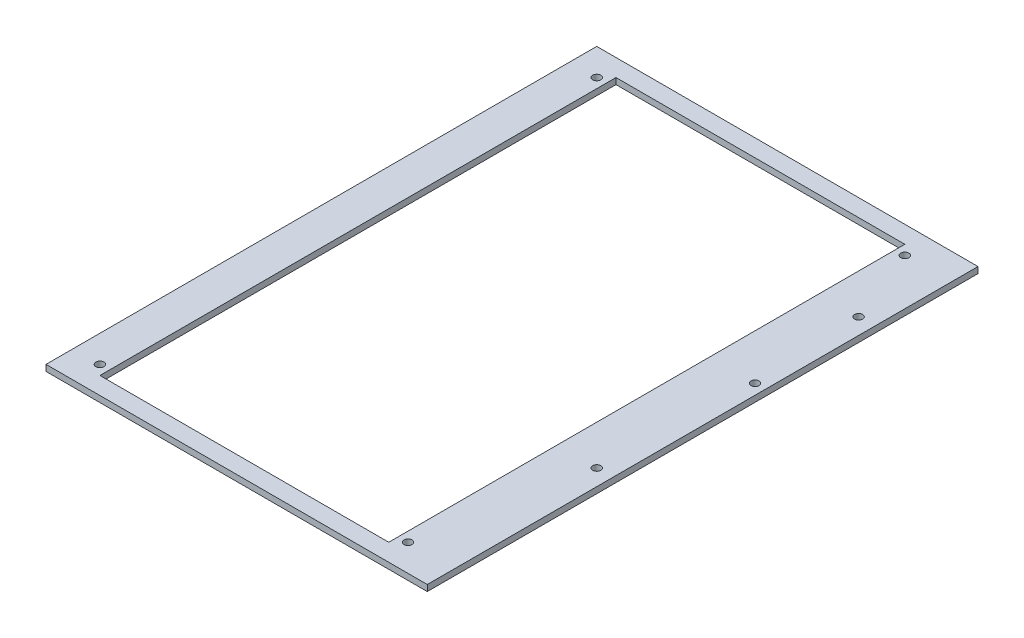
ISO-10303-21;
HEADER;
FILE_DESCRIPTION(('STEP AP214'),'2;1');
FILE_NAME('part.step','',(''),(''),'','','');
FILE_SCHEMA(('AUTOMOTIVE_DESIGN { 1 0 10303 214 1 1 1 1 }'));
ENDSEC;
DATA;
#1=APPLICATION_CONTEXT('core data for automotive mechanical design processes');
#2=APPLICATION_PROTOCOL_DEFINITION('international standard','automotive_design',2000,#1);
#3=PRODUCT_CONTEXT('',#1,'mechanical');
#4=PRODUCT('Part','Part','',(#3));
#5=PRODUCT_RELATED_PRODUCT_CATEGORY('part','',(#4));
#6=PRODUCT_DEFINITION_FORMATION('','',#4);
#7=PRODUCT_DEFINITION_CONTEXT('part definition',#1,'design');
#8=PRODUCT_DEFINITION('design','',#6,#7);
#9=PRODUCT_DEFINITION_SHAPE('','',#8);
#10=(LENGTH_UNIT() NAMED_UNIT(*) SI_UNIT(.MILLI.,.METRE.));
#11=(NAMED_UNIT(*) PLANE_ANGLE_UNIT() SI_UNIT($,.RADIAN.));
#12=(NAMED_UNIT(*) SI_UNIT($,.STERADIAN.) SOLID_ANGLE_UNIT());
#13=UNCERTAINTY_MEASURE_WITH_UNIT(LENGTH_MEASURE(1.E-05),#10,'distance_accuracy_value','');
#14=(GEOMETRIC_REPRESENTATION_CONTEXT(3) GLOBAL_UNCERTAINTY_ASSIGNED_CONTEXT((#13)) GLOBAL_UNIT_ASSIGNED_CONTEXT((#10,
#11,#12)) REPRESENTATION_CONTEXT('',''));
#15=CARTESIAN_POINT('',(0.,0.,0.));
#16=DIRECTION('',(0.,0.,1.));
#17=DIRECTION('',(1.,0.,0.));
#18=AXIS2_PLACEMENT_3D('',#15,#16,#17);
#19=CARTESIAN_POINT('',(0.,1.6,4.5));
#20=DIRECTION('',(0.,0.,-1.));
#21=DIRECTION('',(-1.,0.,0.));
#22=AXIS2_PLACEMENT_3D('',#19,#20,#21);
#23=PLANE('',#22);
#24=DIRECTION('',(1.,0.,0.));
#25=VECTOR('',#24,1.);
#26=CARTESIAN_POINT('',(0.,0.,4.5));
#27=LINE('',#26,#25);
#28=CARTESIAN_POINT('',(9.5,0.,4.5));
#29=VERTEX_POINT('',#28);
#30=CARTESIAN_POINT('',(84.5,0.,4.5));
#31=VERTEX_POINT('',#30);
#32=EDGE_CURVE('E187',#29,#31,#27,.T.);
#33=ORIENTED_EDGE('',*,*,#32,.T.);
#34=DIRECTION('',(0.,-1.,0.));
#35=VECTOR('',#34,1.);
#36=CARTESIAN_POINT('',(84.5,1.6,4.5));
#37=LINE('',#36,#35);
#38=CARTESIAN_POINT('',(84.5,1.6,4.5));
#39=VERTEX_POINT('',#38);
#40=EDGE_CURVE('E11',#39,#31,#37,.T.);
#41=ORIENTED_EDGE('',*,*,#40,.F.);
#42=DIRECTION('',(1.,0.,0.));
#43=VECTOR('',#42,1.);
#44=CARTESIAN_POINT('',(0.,1.6,4.5));
#45=LINE('',#44,#43);
#46=CARTESIAN_POINT('',(9.5,1.6,4.5));
#47=VERTEX_POINT('',#46);
#48=EDGE_CURVE('E123',#47,#39,#45,.T.);
#49=ORIENTED_EDGE('',*,*,#48,.F.);
#50=DIRECTION('',(0.,-1.,0.));
#51=VECTOR('',#50,1.);
#52=CARTESIAN_POINT('',(9.5,1.6,4.5));
#53=LINE('',#52,#51);
#54=EDGE_CURVE('E61',#47,#29,#53,.T.);
#55=ORIENTED_EDGE('',*,*,#54,.T.);
#56=EDGE_LOOP('',(#33,#41,#49,#55));
#57=FACE_BOUND('',#56,.T.);
#58=ADVANCED_FACE('F41',(#57),#23,.F.);
#59=CARTESIAN_POINT('',(84.5,1.6,0.));
#60=DIRECTION('',(1.,0.,0.));
#61=DIRECTION('',(0.,0.,-1.));
#62=AXIS2_PLACEMENT_3D('',#59,#60,#61);
#63=PLANE('',#62);
#64=DIRECTION('',(0.,0.,1.));
#65=VECTOR('',#64,1.);
#66=CARTESIAN_POINT('',(84.5,0.,0.));
#67=LINE('',#66,#65);
#68=CARTESIAN_POINT('',(84.5,0.,138.5));
#69=VERTEX_POINT('',#68);
#70=EDGE_CURVE('E130',#31,#69,#67,.T.);
#71=ORIENTED_EDGE('',*,*,#70,.T.);
#72=DIRECTION('',(0.,-1.,0.));
#73=VECTOR('',#72,1.);
#74=CARTESIAN_POINT('',(84.5,1.6,138.5));
#75=LINE('',#74,#73);
#76=CARTESIAN_POINT('',(84.5,1.6,138.5));
#77=VERTEX_POINT('',#76);
#78=EDGE_CURVE('E52',#77,#69,#75,.T.);
#79=ORIENTED_EDGE('',*,*,#78,.F.);
#80=DIRECTION('',(0.,0.,1.));
#81=VECTOR('',#80,1.);
#82=CARTESIAN_POINT('',(84.5,1.6,0.));
#83=LINE('',#82,#81);
#84=EDGE_CURVE('E116',#39,#77,#83,.T.);
#85=ORIENTED_EDGE('',*,*,#84,.F.);
#86=ORIENTED_EDGE('',*,*,#40,.T.);
#87=EDGE_LOOP('',(#71,#79,#85,#86));
#88=FACE_BOUND('',#87,.T.);
#89=ADVANCED_FACE('F129',(#88),#63,.F.);
#90=CARTESIAN_POINT('',(0.,1.6,138.5));
#91=DIRECTION('',(0.,0.,-1.));
#92=DIRECTION('',(-1.,0.,0.));
#93=AXIS2_PLACEMENT_3D('',#90,#91,#92);
#94=PLANE('',#93);
#95=DIRECTION('',(1.,0.,0.));
#96=VECTOR('',#95,1.);
#97=CARTESIAN_POINT('',(0.,0.,138.5));
#98=LINE('',#97,#96);
#99=CARTESIAN_POINT('',(9.50000000000002,0.,138.5));
#100=VERTEX_POINT('',#99);
#101=EDGE_CURVE('E192',#100,#69,#98,.T.);
#102=ORIENTED_EDGE('',*,*,#101,.F.);
#103=DIRECTION('',(0.,-1.,0.));
#104=VECTOR('',#103,1.);
#105=CARTESIAN_POINT('',(9.50000000000002,1.6,138.5));
#106=LINE('',#105,#104);
#107=CARTESIAN_POINT('',(9.50000000000002,1.6,138.5));
#108=VERTEX_POINT('',#107);
#109=EDGE_CURVE('E87',#108,#100,#106,.T.);
#110=ORIENTED_EDGE('',*,*,#109,.F.);
#111=DIRECTION('',(1.,0.,0.));
#112=VECTOR('',#111,1.);
#113=CARTESIAN_POINT('',(0.,1.6,138.5));
#114=LINE('',#113,#112);
#115=EDGE_CURVE('E122',#108,#77,#114,.T.);
#116=ORIENTED_EDGE('',*,*,#115,.T.);
#117=ORIENTED_EDGE('',*,*,#78,.T.);
#118=EDGE_LOOP('',(#102,#110,#116,#117));
#119=FACE_BOUND('',#118,.T.);
#120=ADVANCED_FACE('F135',(#119),#94,.T.);
#121=CARTESIAN_POINT('',(0.,1.6,143.));
#122=DIRECTION('',(0.,0.,-1.));
#123=DIRECTION('',(-1.,0.,0.));
#124=AXIS2_PLACEMENT_3D('',#121,#122,#123);
#125=PLANE('',#124);
#126=DIRECTION('',(1.,0.,0.));
#127=VECTOR('',#126,1.);
#128=CARTESIAN_POINT('',(0.,0.,143.));
#129=LINE('',#128,#127);
#130=CARTESIAN_POINT('',(0.,0.,143.));
#131=VERTEX_POINT('',#130);
#132=CARTESIAN_POINT('',(99.,0.,143.));
#133=VERTEX_POINT('',#132);
#134=EDGE_CURVE('E152',#131,#133,#129,.T.);
#135=ORIENTED_EDGE('',*,*,#134,.T.);
#136=DIRECTION('',(0.,-1.,0.));
#137=VECTOR('',#136,1.);
#138=CARTESIAN_POINT('',(99.,1.6,143.));
#139=LINE('',#138,#137);
#140=CARTESIAN_POINT('',(99.,1.6,143.));
#141=VERTEX_POINT('',#140);
#142=EDGE_CURVE('E45',#141,#133,#139,.T.);
#143=ORIENTED_EDGE('',*,*,#142,.F.);
#144=DIRECTION('',(1.,0.,0.));
#145=VECTOR('',#144,1.);
#146=CARTESIAN_POINT('',(0.,1.6,143.));
#147=LINE('',#146,#145);
#148=CARTESIAN_POINT('',(0.,1.6,143.));
#149=VERTEX_POINT('',#148);
#150=EDGE_CURVE('E100',#149,#141,#147,.T.);
#151=ORIENTED_EDGE('',*,*,#150,.F.);
#152=DIRECTION('',(0.,-1.,0.));
#153=VECTOR('',#152,1.);
#154=CARTESIAN_POINT('',(0.,1.6,143.));
#155=LINE('',#154,#153);
#156=EDGE_CURVE('E151',#149,#131,#155,.T.);
#157=ORIENTED_EDGE('',*,*,#156,.T.);
#158=EDGE_LOOP('',(#135,#143,#151,#157));
#159=FACE_BOUND('',#158,.T.);
#160=ADVANCED_FACE('F43',(#159),#125,.F.);
#161=CARTESIAN_POINT('',(99.,1.6,0.));
#162=DIRECTION('',(1.,0.,0.));
#163=DIRECTION('',(0.,0.,-1.));
#164=AXIS2_PLACEMENT_3D('',#161,#162,#163);
#165=PLANE('',#164);
#166=DIRECTION('',(0.,0.,1.));
#167=VECTOR('',#166,1.);
#168=CARTESIAN_POINT('',(99.,0.,0.));
#169=LINE('',#168,#167);
#170=CARTESIAN_POINT('',(99.,0.,0.));
#171=VERTEX_POINT('',#170);
#172=EDGE_CURVE('E156',#171,#133,#169,.T.);
#173=ORIENTED_EDGE('',*,*,#172,.F.);
#174=DIRECTION('',(0.,-1.,0.));
#175=VECTOR('',#174,1.);
#176=CARTESIAN_POINT('',(99.,1.6,0.));
#177=LINE('',#176,#175);
#178=CARTESIAN_POINT('',(99.,1.6,0.));
#179=VERTEX_POINT('',#178);
#180=EDGE_CURVE('E216',#179,#171,#177,.T.);
#181=ORIENTED_EDGE('',*,*,#180,.F.);
#182=DIRECTION('',(0.,0.,1.));
#183=VECTOR('',#182,1.);
#184=CARTESIAN_POINT('',(99.,1.6,0.));
#185=LINE('',#184,#183);
#186=EDGE_CURVE('E226',#179,#141,#185,.T.);
#187=ORIENTED_EDGE('',*,*,#186,.T.);
#188=ORIENTED_EDGE('',*,*,#142,.T.);
#189=EDGE_LOOP('',(#173,#181,#187,#188));
#190=FACE_BOUND('',#189,.T.);
#191=ADVANCED_FACE('F225',(#190),#165,.T.);
#192=CARTESIAN_POINT('',(0.,1.6,0.));
#193=DIRECTION('',(0.,0.,-1.));
#194=DIRECTION('',(-1.,0.,0.));
#195=AXIS2_PLACEMENT_3D('',#192,#193,#194);
#196=PLANE('',#195);
#197=DIRECTION('',(1.,0.,0.));
#198=VECTOR('',#197,1.);
#199=CARTESIAN_POINT('',(0.,0.,0.));
#200=LINE('',#199,#198);
#201=CARTESIAN_POINT('',(0.,0.,0.));
#202=VERTEX_POINT('',#201);
#203=EDGE_CURVE('E160',#202,#171,#200,.T.);
#204=ORIENTED_EDGE('',*,*,#203,.F.);
#205=DIRECTION('',(0.,-1.,0.));
#206=VECTOR('',#205,1.);
#207=CARTESIAN_POINT('',(0.,1.6,0.));
#208=LINE('',#207,#206);
#209=CARTESIAN_POINT('',(0.,1.6,0.));
#210=VERTEX_POINT('',#209);
#211=EDGE_CURVE('E214',#210,#202,#208,.T.);
#212=ORIENTED_EDGE('',*,*,#211,.F.);
#213=DIRECTION('',(1.,0.,0.));
#214=VECTOR('',#213,1.);
#215=CARTESIAN_POINT('',(0.,1.6,0.));
#216=LINE('',#215,#214);
#217=EDGE_CURVE('E237',#210,#179,#216,.T.);
#218=ORIENTED_EDGE('',*,*,#217,.T.);
#219=ORIENTED_EDGE('',*,*,#180,.T.);
#220=EDGE_LOOP('',(#204,#212,#218,#219));
#221=FACE_BOUND('',#220,.T.);
#222=ADVANCED_FACE('F234',(#221),#196,.T.);
#223=CARTESIAN_POINT('',(87.,1.6,136.));
#224=DIRECTION('',(0.,-1.,0.));
#225=DIRECTION('',(0.,0.,-1.));
#226=AXIS2_PLACEMENT_3D('',#223,#224,#225);
#227=CYLINDRICAL_SURFACE('',#226,1.04999999999999);
#228=CARTESIAN_POINT('',(87.,1.6,136.));
#229=DIRECTION('',(0.,1.,0.));
#230=DIRECTION('',(0.,0.,1.));
#231=AXIS2_PLACEMENT_3D('',#228,#229,#230);
#232=CIRCLE('',#231,1.04999999999999);
#233=CARTESIAN_POINT('',(87.,1.6,137.05));
#234=VERTEX_POINT('',#233);
#235=EDGE_CURVE('E140',#234,#234,#232,.T.);
#236=ORIENTED_EDGE('',*,*,#235,.T.);
#237=EDGE_LOOP('',(#236));
#238=FACE_BOUND('',#237,.T.);
#239=CARTESIAN_POINT('',(87.,0.,136.));
#240=DIRECTION('',(0.,1.,0.));
#241=DIRECTION('',(0.,0.,1.));
#242=AXIS2_PLACEMENT_3D('',#239,#240,#241);
#243=CIRCLE('',#242,1.04999999999999);
#244=CARTESIAN_POINT('',(87.,0.,137.05));
#245=VERTEX_POINT('',#244);
#246=EDGE_CURVE('E199',#245,#245,#243,.T.);
#247=ORIENTED_EDGE('',*,*,#246,.F.);
#248=EDGE_LOOP('',(#247));
#249=FACE_BOUND('',#248,.T.);
#250=ADVANCED_FACE('F315',(#238,#249),#227,.F.);
#251=CARTESIAN_POINT('',(9.5,1.6,0.));
#252=DIRECTION('',(1.,0.,0.));
#253=DIRECTION('',(0.,0.,-1.));
#254=AXIS2_PLACEMENT_3D('',#251,#252,#253);
#255=PLANE('',#254);
#256=DIRECTION('',(0.,0.,1.));
#257=VECTOR('',#256,1.);
#258=CARTESIAN_POINT('',(9.5,0.,0.));
#259=LINE('',#258,#257);
#260=EDGE_CURVE('E195',#29,#100,#259,.T.);
#261=ORIENTED_EDGE('',*,*,#260,.F.);
#262=ORIENTED_EDGE('',*,*,#54,.F.);
#263=DIRECTION('',(0.,0.,1.));
#264=VECTOR('',#263,1.);
#265=CARTESIAN_POINT('',(9.5,1.6,0.));
#266=LINE('',#265,#264);
#267=EDGE_CURVE('E137',#47,#108,#266,.T.);
#268=ORIENTED_EDGE('',*,*,#267,.T.);
#269=ORIENTED_EDGE('',*,*,#109,.T.);
#270=EDGE_LOOP('',(#261,#262,#268,#269));
#271=FACE_BOUND('',#270,.T.);
#272=ADVANCED_FACE('F296',(#271),#255,.T.);
#273=CARTESIAN_POINT('',(94.8,1.6,26.8));
#274=DIRECTION('',(0.,-1.,0.));
#275=DIRECTION('',(0.,0.,-1.));
#276=AXIS2_PLACEMENT_3D('',#273,#274,#275);
#277=CYLINDRICAL_SURFACE('',#276,1.05);
#278=CARTESIAN_POINT('',(94.8,1.6,26.8));
#279=DIRECTION('',(0.,1.,0.));
#280=DIRECTION('',(0.,0.,1.));
#281=AXIS2_PLACEMENT_3D('',#278,#279,#280);
#282=CIRCLE('',#281,1.05);
#283=CARTESIAN_POINT('',(94.8,1.6,27.85));
#284=VERTEX_POINT('',#283);
#285=EDGE_CURVE('E266',#284,#284,#282,.T.);
#286=ORIENTED_EDGE('',*,*,#285,.T.);
#287=EDGE_LOOP('',(#286));
#288=FACE_BOUND('',#287,.T.);
#289=CARTESIAN_POINT('',(94.8,0.,26.8));
#290=DIRECTION('',(0.,1.,0.));
#291=DIRECTION('',(0.,0.,1.));
#292=AXIS2_PLACEMENT_3D('',#289,#290,#291);
#293=CIRCLE('',#292,1.05);
#294=CARTESIAN_POINT('',(94.8,0.,27.85));
#295=VERTEX_POINT('',#294);
#296=EDGE_CURVE('E183',#295,#295,#293,.T.);
#297=ORIENTED_EDGE('',*,*,#296,.F.);
#298=EDGE_LOOP('',(#297));
#299=FACE_BOUND('',#298,.T.);
#300=ADVANCED_FACE('F272',(#288,#299),#277,.F.);
#301=CARTESIAN_POINT('',(94.8,1.6,94.8));
#302=DIRECTION('',(0.,-1.,0.));
#303=DIRECTION('',(0.,0.,-1.));
#304=AXIS2_PLACEMENT_3D('',#301,#302,#303);
#305=CYLINDRICAL_SURFACE('',#304,1.04999999999999);
#306=CARTESIAN_POINT('',(94.8,1.6,94.8));
#307=DIRECTION('',(0.,1.,0.));
#308=DIRECTION('',(0.,0.,1.));
#309=AXIS2_PLACEMENT_3D('',#306,#307,#308);
#310=CIRCLE('',#309,1.04999999999999);
#311=CARTESIAN_POINT('',(94.8,1.6,95.85));
#312=VERTEX_POINT('',#311);
#313=EDGE_CURVE('E262',#312,#312,#310,.T.);
#314=ORIENTED_EDGE('',*,*,#313,.T.);
#315=EDGE_LOOP('',(#314));
#316=FACE_BOUND('',#315,.T.);
#317=CARTESIAN_POINT('',(94.8,0.,94.8));
#318=DIRECTION('',(0.,1.,0.));
#319=DIRECTION('',(0.,0.,1.));
#320=AXIS2_PLACEMENT_3D('',#317,#318,#319);
#321=CIRCLE('',#320,1.04999999999999);
#322=CARTESIAN_POINT('',(94.8,0.,95.85));
#323=VERTEX_POINT('',#322);
#324=EDGE_CURVE('E179',#323,#323,#321,.T.);
#325=ORIENTED_EDGE('',*,*,#324,.F.);
#326=EDGE_LOOP('',(#325));
#327=FACE_BOUND('',#326,.T.);
#328=ADVANCED_FACE('F295',(#316,#327),#305,.F.);
#329=CARTESIAN_POINT('',(96.3,1.6,55.2));
#330=DIRECTION('',(0.,-1.,0.));
#331=DIRECTION('',(0.,0.,-1.));
#332=AXIS2_PLACEMENT_3D('',#329,#330,#331);
#333=CYLINDRICAL_SURFACE('',#332,1.04999999999999);
#334=CARTESIAN_POINT('',(96.3,1.6,55.2));
#335=DIRECTION('',(0.,1.,0.));
#336=DIRECTION('',(0.,0.,1.));
#337=AXIS2_PLACEMENT_3D('',#334,#335,#336);
#338=CIRCLE('',#337,1.04999999999999);
#339=CARTESIAN_POINT('',(96.3,1.6,56.25));
#340=VERTEX_POINT('',#339);
#341=EDGE_CURVE('E258',#340,#340,#338,.T.);
#342=ORIENTED_EDGE('',*,*,#341,.T.);
#343=EDGE_LOOP('',(#342));
#344=FACE_BOUND('',#343,.T.);
#345=CARTESIAN_POINT('',(96.3,0.,55.2));
#346=DIRECTION('',(0.,1.,0.));
#347=DIRECTION('',(0.,0.,1.));
#348=AXIS2_PLACEMENT_3D('',#345,#346,#347);
#349=CIRCLE('',#348,1.04999999999999);
#350=CARTESIAN_POINT('',(96.3,0.,56.25));
#351=VERTEX_POINT('',#350);
#352=EDGE_CURVE('E175',#351,#351,#349,.T.);
#353=ORIENTED_EDGE('',*,*,#352,.F.);
#354=EDGE_LOOP('',(#353));
#355=FACE_BOUND('',#354,.T.);
#356=ADVANCED_FACE('F299',(#344,#355),#333,.F.);
#357=CARTESIAN_POINT('',(7.,1.6,7.));
#358=DIRECTION('',(0.,-1.,0.));
#359=DIRECTION('',(0.,0.,-1.));
#360=AXIS2_PLACEMENT_3D('',#357,#358,#359);
#361=CYLINDRICAL_SURFACE('',#360,1.04999999999999);
#362=CARTESIAN_POINT('',(7.,1.6,7.));
#363=DIRECTION('',(0.,1.,0.));
#364=DIRECTION('',(0.,0.,1.));
#365=AXIS2_PLACEMENT_3D('',#362,#363,#364);
#366=CIRCLE('',#365,1.04999999999999);
#367=CARTESIAN_POINT('',(7.,1.6,8.05));
#368=VERTEX_POINT('',#367);
#369=EDGE_CURVE('E254',#368,#368,#366,.T.);
#370=ORIENTED_EDGE('',*,*,#369,.T.);
#371=EDGE_LOOP('',(#370));
#372=FACE_BOUND('',#371,.T.);
#373=CARTESIAN_POINT('',(7.,0.,7.));
#374=DIRECTION('',(0.,1.,0.));
#375=DIRECTION('',(0.,0.,1.));
#376=AXIS2_PLACEMENT_3D('',#373,#374,#375);
#377=CIRCLE('',#376,1.04999999999999);
#378=CARTESIAN_POINT('',(7.,0.,8.05));
#379=VERTEX_POINT('',#378);
#380=EDGE_CURVE('E171',#379,#379,#377,.T.);
#381=ORIENTED_EDGE('',*,*,#380,.F.);
#382=EDGE_LOOP('',(#381));
#383=FACE_BOUND('',#382,.T.);
#384=ADVANCED_FACE('F303',(#372,#383),#361,.F.);
#385=CARTESIAN_POINT('',(87.,1.6,7.));
#386=DIRECTION('',(0.,-1.,0.));
#387=DIRECTION('',(0.,0.,-1.));
#388=AXIS2_PLACEMENT_3D('',#385,#386,#387);
#389=CYLINDRICAL_SURFACE('',#388,1.04999999999999);
#390=CARTESIAN_POINT('',(87.,1.6,7.));
#391=DIRECTION('',(0.,1.,0.));
#392=DIRECTION('',(0.,0.,1.));
#393=AXIS2_PLACEMENT_3D('',#390,#391,#392);
#394=CIRCLE('',#393,1.04999999999999);
#395=CARTESIAN_POINT('',(87.,1.6,8.05));
#396=VERTEX_POINT('',#395);
#397=EDGE_CURVE('E242',#396,#396,#394,.T.);
#398=ORIENTED_EDGE('',*,*,#397,.T.);
#399=EDGE_LOOP('',(#398));
#400=FACE_BOUND('',#399,.T.);
#401=CARTESIAN_POINT('',(87.,0.,7.));
#402=DIRECTION('',(0.,1.,0.));
#403=DIRECTION('',(0.,0.,1.));
#404=AXIS2_PLACEMENT_3D('',#401,#402,#403);
#405=CIRCLE('',#404,1.04999999999999);
#406=CARTESIAN_POINT('',(87.,0.,8.05));
#407=VERTEX_POINT('',#406);
#408=EDGE_CURVE('E167',#407,#407,#405,.T.);
#409=ORIENTED_EDGE('',*,*,#408,.F.);
#410=EDGE_LOOP('',(#409));
#411=FACE_BOUND('',#410,.T.);
#412=ADVANCED_FACE('F307',(#400,#411),#389,.F.);
#413=CARTESIAN_POINT('',(0.,1.6,0.));
#414=DIRECTION('',(1.,0.,0.));
#415=DIRECTION('',(0.,0.,-1.));
#416=AXIS2_PLACEMENT_3D('',#413,#414,#415);
#417=PLANE('',#416);
#418=DIRECTION('',(0.,0.,1.));
#419=VECTOR('',#418,1.);
#420=CARTESIAN_POINT('',(0.,0.,0.));
#421=LINE('',#420,#419);
#422=EDGE_CURVE('E164',#202,#131,#421,.T.);
#423=ORIENTED_EDGE('',*,*,#422,.T.);
#424=ORIENTED_EDGE('',*,*,#156,.F.);
#425=DIRECTION('',(0.,0.,1.));
#426=VECTOR('',#425,1.);
#427=CARTESIAN_POINT('',(0.,1.6,0.));
#428=LINE('',#427,#426);
#429=EDGE_CURVE('E239',#210,#149,#428,.T.);
#430=ORIENTED_EDGE('',*,*,#429,.F.);
#431=ORIENTED_EDGE('',*,*,#211,.T.);
#432=EDGE_LOOP('',(#423,#424,#430,#431));
#433=FACE_BOUND('',#432,.T.);
#434=ADVANCED_FACE('F240',(#433),#417,.F.);
#435=CARTESIAN_POINT('',(7.00000000000002,1.6,136.));
#436=DIRECTION('',(0.,-1.,0.));
#437=DIRECTION('',(0.,0.,-1.));
#438=AXIS2_PLACEMENT_3D('',#435,#436,#437);
#439=CYLINDRICAL_SURFACE('',#438,1.04999999999999);
#440=CARTESIAN_POINT('',(7.00000000000002,1.6,136.));
#441=DIRECTION('',(0.,1.,0.));
#442=DIRECTION('',(0.,0.,1.));
#443=AXIS2_PLACEMENT_3D('',#440,#441,#442);
#444=CIRCLE('',#443,1.04999999999999);
#445=CARTESIAN_POINT('',(7.00000000000002,1.6,137.05));
#446=VERTEX_POINT('',#445);
#447=EDGE_CURVE('E147',#446,#446,#444,.T.);
#448=ORIENTED_EDGE('',*,*,#447,.T.);
#449=EDGE_LOOP('',(#448));
#450=FACE_BOUND('',#449,.T.);
#451=CARTESIAN_POINT('',(7.00000000000002,0.,136.));
#452=DIRECTION('',(0.,1.,0.));
#453=DIRECTION('',(0.,0.,1.));
#454=AXIS2_PLACEMENT_3D('',#451,#452,#453);
#455=CIRCLE('',#454,1.04999999999999);
#456=CARTESIAN_POINT('',(7.00000000000002,0.,137.05));
#457=VERTEX_POINT('',#456);
#458=EDGE_CURVE('E203',#457,#457,#455,.T.);
#459=ORIENTED_EDGE('',*,*,#458,.F.);
#460=EDGE_LOOP('',(#459));
#461=FACE_BOUND('',#460,.T.);
#462=ADVANCED_FACE('F276',(#450,#461),#439,.F.);
#463=CARTESIAN_POINT('',(0.,1.6,0.));
#464=DIRECTION('',(0.,1.,0.));
#465=DIRECTION('',(0.,0.,1.));
#466=AXIS2_PLACEMENT_3D('',#463,#464,#465);
#467=PLANE('',#466);
#468=ORIENTED_EDGE('',*,*,#150,.T.);
#469=ORIENTED_EDGE('',*,*,#186,.F.);
#470=ORIENTED_EDGE('',*,*,#217,.F.);
#471=ORIENTED_EDGE('',*,*,#429,.T.);
#472=EDGE_LOOP('',(#468,#469,#470,#471));
#473=FACE_BOUND('',#472,.T.);
#474=ORIENTED_EDGE('',*,*,#397,.F.);
#475=EDGE_LOOP('',(#474));
#476=FACE_BOUND('',#475,.T.);
#477=ORIENTED_EDGE('',*,*,#369,.F.);
#478=EDGE_LOOP('',(#477));
#479=FACE_BOUND('',#478,.T.);
#480=ORIENTED_EDGE('',*,*,#341,.F.);
#481=EDGE_LOOP('',(#480));
#482=FACE_BOUND('',#481,.T.);
#483=ORIENTED_EDGE('',*,*,#313,.F.);
#484=EDGE_LOOP('',(#483));
#485=FACE_BOUND('',#484,.T.);
#486=ORIENTED_EDGE('',*,*,#285,.F.);
#487=EDGE_LOOP('',(#486));
#488=FACE_BOUND('',#487,.T.);
#489=ORIENTED_EDGE('',*,*,#48,.T.);
#490=ORIENTED_EDGE('',*,*,#84,.T.);
#491=ORIENTED_EDGE('',*,*,#115,.F.);
#492=ORIENTED_EDGE('',*,*,#267,.F.);
#493=EDGE_LOOP('',(#489,#490,#491,#492));
#494=FACE_BOUND('',#493,.T.);
#495=ORIENTED_EDGE('',*,*,#235,.F.);
#496=EDGE_LOOP('',(#495));
#497=FACE_BOUND('',#496,.T.);
#498=ORIENTED_EDGE('',*,*,#447,.F.);
#499=EDGE_LOOP('',(#498));
#500=FACE_BOUND('',#499,.T.);
#501=ADVANCED_FACE('F118',(#473,#476,#479,#482,#485,#488,#494,#497,#500),#467,.T.);
#502=CARTESIAN_POINT('',(0.,0.,0.));
#503=DIRECTION('',(0.,1.,0.));
#504=DIRECTION('',(0.,0.,1.));
#505=AXIS2_PLACEMENT_3D('',#502,#503,#504);
#506=PLANE('',#505);
#507=ORIENTED_EDGE('',*,*,#134,.F.);
#508=ORIENTED_EDGE('',*,*,#422,.F.);
#509=ORIENTED_EDGE('',*,*,#203,.T.);
#510=ORIENTED_EDGE('',*,*,#172,.T.);
#511=EDGE_LOOP('',(#507,#508,#509,#510));
#512=FACE_BOUND('',#511,.T.);
#513=ORIENTED_EDGE('',*,*,#408,.T.);
#514=EDGE_LOOP('',(#513));
#515=FACE_BOUND('',#514,.T.);
#516=ORIENTED_EDGE('',*,*,#380,.T.);
#517=EDGE_LOOP('',(#516));
#518=FACE_BOUND('',#517,.T.);
#519=ORIENTED_EDGE('',*,*,#352,.T.);
#520=EDGE_LOOP('',(#519));
#521=FACE_BOUND('',#520,.T.);
#522=ORIENTED_EDGE('',*,*,#324,.T.);
#523=EDGE_LOOP('',(#522));
#524=FACE_BOUND('',#523,.T.);
#525=ORIENTED_EDGE('',*,*,#296,.T.);
#526=EDGE_LOOP('',(#525));
#527=FACE_BOUND('',#526,.T.);
#528=ORIENTED_EDGE('',*,*,#32,.F.);
#529=ORIENTED_EDGE('',*,*,#260,.T.);
#530=ORIENTED_EDGE('',*,*,#101,.T.);
#531=ORIENTED_EDGE('',*,*,#70,.F.);
#532=EDGE_LOOP('',(#528,#529,#530,#531));
#533=FACE_BOUND('',#532,.T.);
#534=ORIENTED_EDGE('',*,*,#246,.T.);
#535=EDGE_LOOP('',(#534));
#536=FACE_BOUND('',#535,.T.);
#537=ORIENTED_EDGE('',*,*,#458,.T.);
#538=EDGE_LOOP('',(#537));
#539=FACE_BOUND('',#538,.T.);
#540=ADVANCED_FACE('F232',(#512,#515,#518,#521,#524,#527,#533,#536,#539),#506,.F.);
#541=CLOSED_SHELL('',(#58,#89,#120,#160,#191,#222,#250,#272,#300,#328,#356,#384,#412,#434,#462,
#501,#540));
#542=MANIFOLD_SOLID_BREP('B2',#541);
#543=ADVANCED_BREP_SHAPE_REPRESENTATION('',(#18,#542),#14);
#544=SHAPE_DEFINITION_REPRESENTATION(#9,#543);
ENDSEC;
END-ISO-10303-21;
